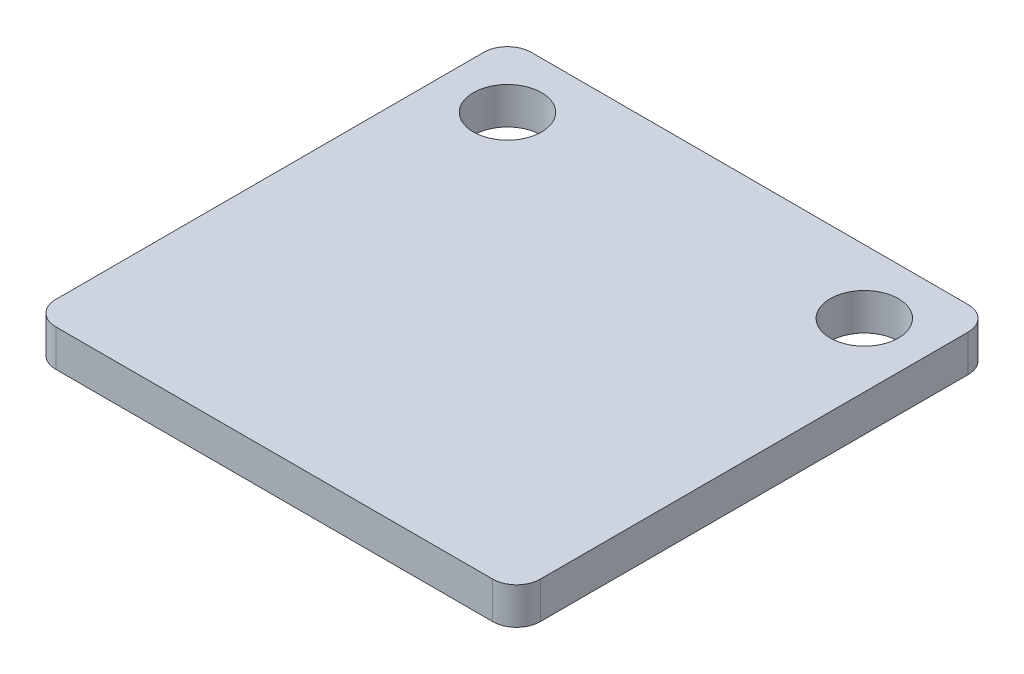
ISO-10303-21;
HEADER;
FILE_DESCRIPTION(('STEP AP214'),'2;1');
FILE_NAME('part.step','',(''),(''),'','','');
FILE_SCHEMA(('AUTOMOTIVE_DESIGN { 1 0 10303 214 1 1 1 1 }'));
ENDSEC;
DATA;
#1=APPLICATION_CONTEXT('core data for automotive mechanical design processes');
#2=APPLICATION_PROTOCOL_DEFINITION('international standard','automotive_design',2000,#1);
#3=PRODUCT_CONTEXT('',#1,'mechanical');
#4=PRODUCT('Part','Part','',(#3));
#5=PRODUCT_RELATED_PRODUCT_CATEGORY('part','',(#4));
#6=PRODUCT_DEFINITION_FORMATION('','',#4);
#7=PRODUCT_DEFINITION_CONTEXT('part definition',#1,'design');
#8=PRODUCT_DEFINITION('design','',#6,#7);
#9=PRODUCT_DEFINITION_SHAPE('','',#8);
#10=(LENGTH_UNIT() NAMED_UNIT(*) SI_UNIT(.MILLI.,.METRE.));
#11=(NAMED_UNIT(*) PLANE_ANGLE_UNIT() SI_UNIT($,.RADIAN.));
#12=(NAMED_UNIT(*) SI_UNIT($,.STERADIAN.) SOLID_ANGLE_UNIT());
#13=UNCERTAINTY_MEASURE_WITH_UNIT(LENGTH_MEASURE(1.E-05),#10,'distance_accuracy_value','');
#14=(GEOMETRIC_REPRESENTATION_CONTEXT(3) GLOBAL_UNCERTAINTY_ASSIGNED_CONTEXT((#13)) GLOBAL_UNIT_ASSIGNED_CONTEXT((#10,
#11,#12)) REPRESENTATION_CONTEXT('',''));
#15=CARTESIAN_POINT('',(0.,0.,0.));
#16=DIRECTION('',(0.,0.,1.));
#17=DIRECTION('',(1.,0.,0.));
#18=AXIS2_PLACEMENT_3D('',#15,#16,#17);
#19=CARTESIAN_POINT('',(0.,-0.775,0.));
#20=DIRECTION('',(0.,-1.,0.));
#21=DIRECTION('',(0.,0.,-1.));
#22=AXIS2_PLACEMENT_3D('',#19,#20,#21);
#23=PLANE('',#22);
#24=CARTESIAN_POINT('',(-7.50499999999992,-0.775,-7.31500000000006));
#25=DIRECTION('',(0.,1.,0.));
#26=DIRECTION('',(0.,0.,1.));
#27=AXIS2_PLACEMENT_3D('',#24,#25,#26);
#28=CIRCLE('',#27,1.435);
#29=CARTESIAN_POINT('',(-7.50499999999992,-0.775,-5.88000000000005));
#30=VERTEX_POINT('',#29);
#31=EDGE_CURVE('E155',#30,#30,#28,.T.);
#32=ORIENTED_EDGE('',*,*,#31,.T.);
#33=EDGE_LOOP('',(#32));
#34=FACE_BOUND('',#33,.T.);
#35=CARTESIAN_POINT('',(7.50500000000009,-0.775,-7.31500000000006));
#36=DIRECTION('',(0.,1.,0.));
#37=DIRECTION('',(0.,0.,1.));
#38=AXIS2_PLACEMENT_3D('',#35,#36,#37);
#39=CIRCLE('',#38,1.435);
#40=CARTESIAN_POINT('',(7.50500000000009,-0.775,-5.88000000000005));
#41=VERTEX_POINT('',#40);
#42=EDGE_CURVE('E152',#41,#41,#39,.T.);
#43=ORIENTED_EDGE('',*,*,#42,.T.);
#44=EDGE_LOOP('',(#43));
#45=FACE_BOUND('',#44,.T.);
#46=DIRECTION('',(0.,0.,-1.));
#47=VECTOR('',#46,1.);
#48=CARTESIAN_POINT('',(10.1900000000001,-0.775,9.99999999999994));
#49=LINE('',#48,#47);
#50=CARTESIAN_POINT('',(10.1900000000001,-0.775,8.99999999999994));
#51=VERTEX_POINT('',#50);
#52=CARTESIAN_POINT('',(10.1900000000001,-0.775,-9.00000000000006));
#53=VERTEX_POINT('',#52);
#54=EDGE_CURVE('E168',#51,#53,#49,.T.);
#55=ORIENTED_EDGE('',*,*,#54,.F.);
#56=CARTESIAN_POINT('',(9.19000000000009,-0.775,8.99999999999994));
#57=DIRECTION('',(0.,-1.,0.));
#58=DIRECTION('',(0.,0.,-1.));
#59=AXIS2_PLACEMENT_3D('',#56,#57,#58);
#60=CIRCLE('',#59,1.);
#61=CARTESIAN_POINT('',(9.19000000000009,-0.775,9.99999999999994));
#62=VERTEX_POINT('',#61);
#63=EDGE_CURVE('E201',#51,#62,#60,.T.);
#64=ORIENTED_EDGE('',*,*,#63,.T.);
#65=DIRECTION('',(1.,0.,0.));
#66=VECTOR('',#65,1.);
#67=CARTESIAN_POINT('',(-10.1899999999999,-0.775,9.99999999999994));
#68=LINE('',#67,#66);
#69=CARTESIAN_POINT('',(-9.18999999999992,-0.775,9.99999999999994));
#70=VERTEX_POINT('',#69);
#71=EDGE_CURVE('E173',#70,#62,#68,.T.);
#72=ORIENTED_EDGE('',*,*,#71,.F.);
#73=CARTESIAN_POINT('',(-9.18999999999992,-0.775,8.99999999999994));
#74=DIRECTION('',(0.,-1.,0.));
#75=DIRECTION('',(0.,0.,-1.));
#76=AXIS2_PLACEMENT_3D('',#73,#74,#75);
#77=CIRCLE('',#76,1.);
#78=CARTESIAN_POINT('',(-10.1899999999999,-0.775,8.99999999999994));
#79=VERTEX_POINT('',#78);
#80=EDGE_CURVE('E199',#70,#79,#77,.T.);
#81=ORIENTED_EDGE('',*,*,#80,.T.);
#82=DIRECTION('',(0.,0.,1.));
#83=VECTOR('',#82,1.);
#84=CARTESIAN_POINT('',(-10.1899999999999,-0.775,9.99999999999994));
#85=LINE('',#84,#83);
#86=CARTESIAN_POINT('',(-10.1899999999999,-0.775,-9.00000000000006));
#87=VERTEX_POINT('',#86);
#88=EDGE_CURVE('E187',#87,#79,#85,.T.);
#89=ORIENTED_EDGE('',*,*,#88,.F.);
#90=CARTESIAN_POINT('',(-9.18999999999992,-0.775,-9.00000000000006));
#91=DIRECTION('',(0.,-1.,0.));
#92=DIRECTION('',(0.,0.,-1.));
#93=AXIS2_PLACEMENT_3D('',#90,#91,#92);
#94=CIRCLE('',#93,1.);
#95=CARTESIAN_POINT('',(-9.18999999999992,-0.775,-10.0000000000001));
#96=VERTEX_POINT('',#95);
#97=EDGE_CURVE('E195',#87,#96,#94,.T.);
#98=ORIENTED_EDGE('',*,*,#97,.T.);
#99=DIRECTION('',(-1.,0.,0.));
#100=VECTOR('',#99,1.);
#101=CARTESIAN_POINT('',(-10.1899999999999,-0.775,-10.0000000000001));
#102=LINE('',#101,#100);
#103=CARTESIAN_POINT('',(9.19000000000008,-0.775,-10.0000000000001));
#104=VERTEX_POINT('',#103);
#105=EDGE_CURVE('E184',#104,#96,#102,.T.);
#106=ORIENTED_EDGE('',*,*,#105,.F.);
#107=CARTESIAN_POINT('',(9.19000000000008,-0.775,-9.00000000000006));
#108=DIRECTION('',(0.,-1.,0.));
#109=DIRECTION('',(0.,0.,-1.));
#110=AXIS2_PLACEMENT_3D('',#107,#108,#109);
#111=CIRCLE('',#110,1.);
#112=EDGE_CURVE('E197',#104,#53,#111,.T.);
#113=ORIENTED_EDGE('',*,*,#112,.T.);
#114=EDGE_LOOP('',(#55,#64,#72,#81,#89,#98,#106,#113));
#115=FACE_BOUND('',#114,.T.);
#116=DIRECTION('',(1.,0.,0.));
#117=VECTOR('',#116,1.);
#118=CARTESIAN_POINT('',(1.,-0.775,-1.28));
#119=LINE('',#118,#117);
#120=CARTESIAN_POINT('',(-1.,-0.775,-1.28));
#121=VERTEX_POINT('',#120);
#122=CARTESIAN_POINT('',(1.,-0.775,-1.28));
#123=VERTEX_POINT('',#122);
#124=EDGE_CURVE('E411',#121,#123,#119,.T.);
#125=ORIENTED_EDGE('',*,*,#124,.F.);
#126=DIRECTION('',(0.,0.,-1.));
#127=VECTOR('',#126,1.);
#128=CARTESIAN_POINT('',(-1.,-0.775,1.28));
#129=LINE('',#128,#127);
#130=CARTESIAN_POINT('',(-1.,-0.775,1.28));
#131=VERTEX_POINT('',#130);
#132=EDGE_CURVE('E150',#131,#121,#129,.T.);
#133=ORIENTED_EDGE('',*,*,#132,.F.);
#134=DIRECTION('',(-1.,0.,0.));
#135=VECTOR('',#134,1.);
#136=CARTESIAN_POINT('',(1.,-0.775,1.28));
#137=LINE('',#136,#135);
#138=CARTESIAN_POINT('',(1.,-0.775,1.28));
#139=VERTEX_POINT('',#138);
#140=EDGE_CURVE('E146',#139,#131,#137,.T.);
#141=ORIENTED_EDGE('',*,*,#140,.F.);
#142=DIRECTION('',(0.,0.,1.));
#143=VECTOR('',#142,1.);
#144=CARTESIAN_POINT('',(1.,-0.775,1.28));
#145=LINE('',#144,#143);
#146=EDGE_CURVE('E408',#123,#139,#145,.T.);
#147=ORIENTED_EDGE('',*,*,#146,.F.);
#148=EDGE_LOOP('',(#125,#133,#141,#147));
#149=FACE_BOUND('',#148,.T.);
#150=ADVANCED_FACE('F36',(#34,#45,#115,#149),#23,.T.);
#151=CARTESIAN_POINT('',(10.1900000000001,0.775,9.99999999999994));
#152=DIRECTION('',(-1.,0.,0.));
#153=DIRECTION('',(0.,0.,1.));
#154=AXIS2_PLACEMENT_3D('',#151,#152,#153);
#155=PLANE('',#154);
#156=DIRECTION('',(0.,0.,-1.));
#157=VECTOR('',#156,1.);
#158=CARTESIAN_POINT('',(10.1900000000001,0.775,9.99999999999994));
#159=LINE('',#158,#157);
#160=CARTESIAN_POINT('',(10.1900000000001,0.775,8.99999999999994));
#161=VERTEX_POINT('',#160);
#162=CARTESIAN_POINT('',(10.1900000000001,0.775,-9.00000000000006));
#163=VERTEX_POINT('',#162);
#164=EDGE_CURVE('E169',#161,#163,#159,.T.);
#165=ORIENTED_EDGE('',*,*,#164,.F.);
#166=DIRECTION('',(0.,-1.,0.));
#167=VECTOR('',#166,1.);
#168=CARTESIAN_POINT('',(10.1900000000001,0.775,8.99999999999994));
#169=LINE('',#168,#167);
#170=EDGE_CURVE('E192',#161,#51,#169,.T.);
#171=ORIENTED_EDGE('',*,*,#170,.T.);
#172=ORIENTED_EDGE('',*,*,#54,.T.);
#173=DIRECTION('',(0.,-1.,0.));
#174=VECTOR('',#173,1.);
#175=CARTESIAN_POINT('',(10.1900000000001,0.775,-9.00000000000006));
#176=LINE('',#175,#174);
#177=EDGE_CURVE('E181',#53,#163,#176,.F.);
#178=ORIENTED_EDGE('',*,*,#177,.T.);
#179=EDGE_LOOP('',(#165,#171,#172,#178));
#180=FACE_BOUND('',#179,.T.);
#181=ADVANCED_FACE('F251',(#180),#155,.F.);
#182=CARTESIAN_POINT('',(-10.1899999999999,0.775,-10.0000000000001));
#183=DIRECTION('',(0.,0.,1.));
#184=DIRECTION('',(1.,0.,0.));
#185=AXIS2_PLACEMENT_3D('',#182,#183,#184);
#186=PLANE('',#185);
#187=DIRECTION('',(-1.,0.,0.));
#188=VECTOR('',#187,1.);
#189=CARTESIAN_POINT('',(-10.1899999999999,0.775,-10.0000000000001));
#190=LINE('',#189,#188);
#191=CARTESIAN_POINT('',(9.19000000000008,0.775,-10.0000000000001));
#192=VERTEX_POINT('',#191);
#193=CARTESIAN_POINT('',(-9.18999999999992,0.775,-10.0000000000001));
#194=VERTEX_POINT('',#193);
#195=EDGE_CURVE('E172',#192,#194,#190,.T.);
#196=ORIENTED_EDGE('',*,*,#195,.F.);
#197=DIRECTION('',(0.,-1.,0.));
#198=VECTOR('',#197,1.);
#199=CARTESIAN_POINT('',(9.19000000000008,0.775,-10.0000000000001));
#200=LINE('',#199,#198);
#201=EDGE_CURVE('E11',#192,#104,#200,.T.);
#202=ORIENTED_EDGE('',*,*,#201,.T.);
#203=ORIENTED_EDGE('',*,*,#105,.T.);
#204=DIRECTION('',(0.,-1.,0.));
#205=VECTOR('',#204,1.);
#206=CARTESIAN_POINT('',(-9.18999999999992,0.775,-10.0000000000001));
#207=LINE('',#206,#205);
#208=EDGE_CURVE('E44',#96,#194,#207,.F.);
#209=ORIENTED_EDGE('',*,*,#208,.T.);
#210=EDGE_LOOP('',(#196,#202,#203,#209));
#211=FACE_BOUND('',#210,.T.);
#212=ADVANCED_FACE('F222',(#211),#186,.F.);
#213=CARTESIAN_POINT('',(-10.1899999999999,0.775,9.99999999999994));
#214=DIRECTION('',(1.,0.,0.));
#215=DIRECTION('',(0.,0.,-1.));
#216=AXIS2_PLACEMENT_3D('',#213,#214,#215);
#217=PLANE('',#216);
#218=ORIENTED_EDGE('',*,*,#88,.T.);
#219=DIRECTION('',(0.,-1.,0.));
#220=VECTOR('',#219,1.);
#221=CARTESIAN_POINT('',(-10.1899999999999,0.775,8.99999999999994));
#222=LINE('',#221,#220);
#223=CARTESIAN_POINT('',(-10.1899999999999,0.775,8.99999999999994));
#224=VERTEX_POINT('',#223);
#225=EDGE_CURVE('E59',#79,#224,#222,.F.);
#226=ORIENTED_EDGE('',*,*,#225,.T.);
#227=DIRECTION('',(0.,0.,1.));
#228=VECTOR('',#227,1.);
#229=CARTESIAN_POINT('',(-10.1899999999999,0.775,9.99999999999994));
#230=LINE('',#229,#228);
#231=CARTESIAN_POINT('',(-10.1899999999999,0.775,-9.00000000000006));
#232=VERTEX_POINT('',#231);
#233=EDGE_CURVE('E176',#232,#224,#230,.T.);
#234=ORIENTED_EDGE('',*,*,#233,.F.);
#235=DIRECTION('',(0.,-1.,0.));
#236=VECTOR('',#235,1.);
#237=CARTESIAN_POINT('',(-10.1899999999999,0.775,-9.00000000000006));
#238=LINE('',#237,#236);
#239=EDGE_CURVE('E216',#232,#87,#238,.T.);
#240=ORIENTED_EDGE('',*,*,#239,.T.);
#241=EDGE_LOOP('',(#218,#226,#234,#240));
#242=FACE_BOUND('',#241,.T.);
#243=ADVANCED_FACE('F232',(#242),#217,.F.);
#244=CARTESIAN_POINT('',(-10.1899999999999,0.775,9.99999999999994));
#245=DIRECTION('',(0.,0.,-1.));
#246=DIRECTION('',(-1.,0.,0.));
#247=AXIS2_PLACEMENT_3D('',#244,#245,#246);
#248=PLANE('',#247);
#249=ORIENTED_EDGE('',*,*,#71,.T.);
#250=DIRECTION('',(0.,-1.,0.));
#251=VECTOR('',#250,1.);
#252=CARTESIAN_POINT('',(9.19000000000009,0.775,9.99999999999994));
#253=LINE('',#252,#251);
#254=CARTESIAN_POINT('',(9.19000000000009,0.775,9.99999999999994));
#255=VERTEX_POINT('',#254);
#256=EDGE_CURVE('E206',#62,#255,#253,.F.);
#257=ORIENTED_EDGE('',*,*,#256,.T.);
#258=DIRECTION('',(1.,0.,0.));
#259=VECTOR('',#258,1.);
#260=CARTESIAN_POINT('',(-10.1899999999999,0.775,9.99999999999994));
#261=LINE('',#260,#259);
#262=CARTESIAN_POINT('',(-9.18999999999992,0.775,9.99999999999994));
#263=VERTEX_POINT('',#262);
#264=EDGE_CURVE('E178',#263,#255,#261,.T.);
#265=ORIENTED_EDGE('',*,*,#264,.F.);
#266=DIRECTION('',(0.,-1.,0.));
#267=VECTOR('',#266,1.);
#268=CARTESIAN_POINT('',(-9.18999999999992,0.775,9.99999999999994));
#269=LINE('',#268,#267);
#270=EDGE_CURVE('E203',#263,#70,#269,.T.);
#271=ORIENTED_EDGE('',*,*,#270,.T.);
#272=EDGE_LOOP('',(#249,#257,#265,#271));
#273=FACE_BOUND('',#272,.T.);
#274=ADVANCED_FACE('F243',(#273),#248,.F.);
#275=CARTESIAN_POINT('',(0.,0.775,0.));
#276=DIRECTION('',(0.,-1.,0.));
#277=DIRECTION('',(0.,0.,-1.));
#278=AXIS2_PLACEMENT_3D('',#275,#276,#277);
#279=PLANE('',#278);
#280=CARTESIAN_POINT('',(-7.50499999999992,0.775,-7.31500000000006));
#281=DIRECTION('',(0.,-1.,0.));
#282=DIRECTION('',(0.,0.,-1.));
#283=AXIS2_PLACEMENT_3D('',#280,#281,#282);
#284=CIRCLE('',#283,1.435);
#285=CARTESIAN_POINT('',(-7.50499999999992,0.775,-5.88000000000005));
#286=VERTEX_POINT('',#285);
#287=EDGE_CURVE('E165',#286,#286,#284,.T.);
#288=ORIENTED_EDGE('',*,*,#287,.T.);
#289=EDGE_LOOP('',(#288));
#290=FACE_BOUND('',#289,.T.);
#291=CARTESIAN_POINT('',(7.50500000000009,0.775,-7.31500000000006));
#292=DIRECTION('',(0.,-1.,0.));
#293=DIRECTION('',(0.,0.,-1.));
#294=AXIS2_PLACEMENT_3D('',#291,#292,#293);
#295=CIRCLE('',#294,1.435);
#296=CARTESIAN_POINT('',(7.50500000000009,0.775,-5.88000000000005));
#297=VERTEX_POINT('',#296);
#298=EDGE_CURVE('E161',#297,#297,#295,.T.);
#299=ORIENTED_EDGE('',*,*,#298,.T.);
#300=EDGE_LOOP('',(#299));
#301=FACE_BOUND('',#300,.T.);
#302=ORIENTED_EDGE('',*,*,#264,.T.);
#303=CARTESIAN_POINT('',(9.19000000000009,0.775,8.99999999999994));
#304=DIRECTION('',(0.,-1.,0.));
#305=DIRECTION('',(0.,0.,-1.));
#306=AXIS2_PLACEMENT_3D('',#303,#304,#305);
#307=CIRCLE('',#306,1.);
#308=EDGE_CURVE('E214',#255,#161,#307,.F.);
#309=ORIENTED_EDGE('',*,*,#308,.T.);
#310=ORIENTED_EDGE('',*,*,#164,.T.);
#311=CARTESIAN_POINT('',(9.19000000000008,0.775,-9.00000000000006));
#312=DIRECTION('',(0.,-1.,0.));
#313=DIRECTION('',(0.,0.,-1.));
#314=AXIS2_PLACEMENT_3D('',#311,#312,#313);
#315=CIRCLE('',#314,1.);
#316=EDGE_CURVE('E210',#163,#192,#315,.F.);
#317=ORIENTED_EDGE('',*,*,#316,.T.);
#318=ORIENTED_EDGE('',*,*,#195,.T.);
#319=CARTESIAN_POINT('',(-9.18999999999992,0.775,-9.00000000000006));
#320=DIRECTION('',(0.,-1.,0.));
#321=DIRECTION('',(0.,0.,-1.));
#322=AXIS2_PLACEMENT_3D('',#319,#320,#321);
#323=CIRCLE('',#322,1.);
#324=EDGE_CURVE('E208',#194,#232,#323,.F.);
#325=ORIENTED_EDGE('',*,*,#324,.T.);
#326=ORIENTED_EDGE('',*,*,#233,.T.);
#327=CARTESIAN_POINT('',(-9.18999999999992,0.775,8.99999999999994));
#328=DIRECTION('',(0.,-1.,0.));
#329=DIRECTION('',(0.,0.,-1.));
#330=AXIS2_PLACEMENT_3D('',#327,#328,#329);
#331=CIRCLE('',#330,1.);
#332=EDGE_CURVE('E212',#224,#263,#331,.F.);
#333=ORIENTED_EDGE('',*,*,#332,.T.);
#334=EDGE_LOOP('',(#302,#309,#310,#317,#318,#325,#326,#333));
#335=FACE_BOUND('',#334,.T.);
#336=ADVANCED_FACE('F228',(#290,#301,#335),#279,.F.);
#337=CARTESIAN_POINT('',(7.50500000000009,-0.775,-7.31500000000006));
#338=DIRECTION('',(0.,1.,0.));
#339=DIRECTION('',(0.,0.,1.));
#340=AXIS2_PLACEMENT_3D('',#337,#338,#339);
#341=CYLINDRICAL_SURFACE('',#340,1.435);
#342=CARTESIAN_POINT('',(7.50500000000009,-0.775,-5.88000000000005));
#343=CARTESIAN_POINT('',(7.50500000000009,-0.758854166666667,-5.88000000000005));
#344=CARTESIAN_POINT('',(7.50500000000009,-0.742708333333333,-5.88000000000005));
#345=CARTESIAN_POINT('',(7.50500000000009,-0.710416666666667,-5.88000000000005));
#346=CARTESIAN_POINT('',(7.50500000000009,-0.694270833333333,-5.88000000000005));
#347=CARTESIAN_POINT('',(7.50500000000009,-0.661979166666667,-5.88000000000005));
#348=CARTESIAN_POINT('',(7.50500000000009,-0.645833333333333,-5.88000000000005));
#349=CARTESIAN_POINT('',(7.50500000000009,-0.613541666666667,-5.88000000000005));
#350=CARTESIAN_POINT('',(7.50500000000009,-0.597395833333333,-5.88000000000005));
#351=CARTESIAN_POINT('',(7.50500000000009,-0.565104166666667,-5.88000000000005));
#352=CARTESIAN_POINT('',(7.50500000000009,-0.548958333333333,-5.88000000000005));
#353=CARTESIAN_POINT('',(7.50500000000009,-0.516666666666667,-5.88000000000005));
#354=CARTESIAN_POINT('',(7.50500000000009,-0.500520833333333,-5.88000000000005));
#355=CARTESIAN_POINT('',(7.50500000000009,-0.468229166666667,-5.88000000000005));
#356=CARTESIAN_POINT('',(7.50500000000009,-0.452083333333333,-5.88000000000005));
#357=CARTESIAN_POINT('',(7.50500000000009,-0.419791666666667,-5.88000000000005));
#358=CARTESIAN_POINT('',(7.50500000000009,-0.403645833333333,-5.88000000000005));
#359=CARTESIAN_POINT('',(7.50500000000009,-0.371354166666667,-5.88000000000005));
#360=CARTESIAN_POINT('',(7.50500000000009,-0.355208333333333,-5.88000000000005));
#361=CARTESIAN_POINT('',(7.50500000000009,-0.322916666666667,-5.88000000000005));
#362=CARTESIAN_POINT('',(7.50500000000009,-0.306770833333333,-5.88000000000005));
#363=CARTESIAN_POINT('',(7.50500000000009,-0.274479166666667,-5.88000000000005));
#364=CARTESIAN_POINT('',(7.50500000000009,-0.258333333333333,-5.88000000000005));
#365=CARTESIAN_POINT('',(7.50500000000009,-0.226041666666667,-5.88000000000005));
#366=CARTESIAN_POINT('',(7.50500000000009,-0.209895833333333,-5.88000000000005));
#367=CARTESIAN_POINT('',(7.50500000000009,-0.177604166666667,-5.88000000000005));
#368=CARTESIAN_POINT('',(7.50500000000009,-0.161458333333333,-5.88000000000005));
#369=CARTESIAN_POINT('',(7.50500000000009,-0.129166666666667,-5.88000000000005));
#370=CARTESIAN_POINT('',(7.50500000000009,-0.113020833333333,-5.88000000000005));
#371=CARTESIAN_POINT('',(7.50500000000009,-0.0807291666666667,-5.88000000000005));
#372=CARTESIAN_POINT('',(7.50500000000009,-0.0645833333333334,-5.88000000000005));
#373=CARTESIAN_POINT('',(7.50500000000009,-0.0322916666666668,-5.88000000000005));
#374=CARTESIAN_POINT('',(7.50500000000009,-0.0161458333333334,-5.88000000000005));
#375=CARTESIAN_POINT('',(7.50500000000009,0.0161458333333332,-5.88000000000005));
#376=CARTESIAN_POINT('',(7.50500000000009,0.0322916666666665,-5.88000000000005));
#377=CARTESIAN_POINT('',(7.50500000000009,0.0645833333333332,-5.88000000000005));
#378=CARTESIAN_POINT('',(7.50500000000009,0.0807291666666665,-5.88000000000005));
#379=CARTESIAN_POINT('',(7.50500000000009,0.113020833333333,-5.88000000000005));
#380=CARTESIAN_POINT('',(7.50500000000009,0.129166666666667,-5.88000000000005));
#381=CARTESIAN_POINT('',(7.50500000000009,0.161458333333333,-5.88000000000005));
#382=CARTESIAN_POINT('',(7.50500000000009,0.177604166666667,-5.88000000000005));
#383=CARTESIAN_POINT('',(7.50500000000009,0.209895833333333,-5.88000000000005));
#384=CARTESIAN_POINT('',(7.50500000000009,0.226041666666667,-5.88000000000005));
#385=CARTESIAN_POINT('',(7.50500000000009,0.258333333333333,-5.88000000000005));
#386=CARTESIAN_POINT('',(7.50500000000009,0.274479166666667,-5.88000000000005));
#387=CARTESIAN_POINT('',(7.50500000000009,0.306770833333333,-5.88000000000005));
#388=CARTESIAN_POINT('',(7.50500000000009,0.322916666666667,-5.88000000000005));
#389=CARTESIAN_POINT('',(7.50500000000009,0.355208333333333,-5.88000000000005));
#390=CARTESIAN_POINT('',(7.50500000000009,0.371354166666667,-5.88000000000005));
#391=CARTESIAN_POINT('',(7.50500000000009,0.403645833333333,-5.88000000000005));
#392=CARTESIAN_POINT('',(7.50500000000009,0.419791666666667,-5.88000000000005));
#393=CARTESIAN_POINT('',(7.50500000000009,0.452083333333333,-5.88000000000005));
#394=CARTESIAN_POINT('',(7.50500000000009,0.468229166666667,-5.88000000000005));
#395=CARTESIAN_POINT('',(7.50500000000009,0.500520833333333,-5.88000000000005));
#396=CARTESIAN_POINT('',(7.50500000000009,0.516666666666667,-5.88000000000005));
#397=CARTESIAN_POINT('',(7.50500000000009,0.548958333333333,-5.88000000000005));
#398=CARTESIAN_POINT('',(7.50500000000009,0.565104166666667,-5.88000000000005));
#399=CARTESIAN_POINT('',(7.50500000000009,0.597395833333333,-5.88000000000005));
#400=CARTESIAN_POINT('',(7.50500000000009,0.613541666666667,-5.88000000000005));
#401=CARTESIAN_POINT('',(7.50500000000009,0.645833333333333,-5.88000000000005));
#402=CARTESIAN_POINT('',(7.50500000000009,0.661979166666667,-5.88000000000005));
#403=CARTESIAN_POINT('',(7.50500000000009,0.694270833333333,-5.88000000000005));
#404=CARTESIAN_POINT('',(7.50500000000009,0.710416666666667,-5.88000000000005));
#405=CARTESIAN_POINT('',(7.50500000000009,0.742708333333333,-5.88000000000005));
#406=CARTESIAN_POINT('',(7.50500000000009,0.758854166666667,-5.88000000000005));
#407=CARTESIAN_POINT('',(7.50500000000009,0.775,-5.88000000000005));
#408=B_SPLINE_CURVE_WITH_KNOTS('',3,(#342,#343,#344,#345,#346,#347,#348,#349,#350,#351,#352,
#353,#354,#355,#356,#357,#358,#359,#360,#361,#362,#363,#364,#365,#366,#367,#368,#369,#370,#371,
#372,#373,#374,#375,#376,#377,#378,#379,#380,#381,#382,#383,#384,#385,#386,#387,#388,#389,#390,
#391,#392,#393,#394,#395,#396,#397,#398,#399,#400,#401,#402,#403,#404,#405,#406,#407),
.UNSPECIFIED.,.F.,.F.,(4,2,2,2,2,2,2,2,2,2,2,2,2,2,2,2,2,2,2,2,2,2,2,2,2,2,2,2,2,2,2,2,4),(0.,
0.0484375000000001,0.0968750000000001,0.1453125,0.19375,0.2421875,0.290625,0.3390625,0.3875,
0.4359375,0.484375,0.5328125,0.58125,0.6296875,0.678125,0.7265625,0.775,0.8234375,0.871875,
0.9203125,0.96875,1.0171875,1.065625,1.1140625,1.1625,1.2109375,1.259375,1.3078125,1.35625,
1.4046875,1.453125,1.5015625,1.55),.UNSPECIFIED.);
#409=EDGE_CURVE('BSEAM283',#41,#297,#408,.T.);
#410=ORIENTED_EDGE('',*,*,#42,.F.);
#411=ORIENTED_EDGE('',*,*,#298,.F.);
#412=ORIENTED_EDGE('',*,*,#409,.T.);
#413=ORIENTED_EDGE('',*,*,#409,.F.);
#414=EDGE_LOOP('',(#410,#412,#411,#413));
#415=FACE_BOUND('',#414,.T.);
#416=ADVANCED_FACE('F283',(#415),#341,.F.);
#417=CARTESIAN_POINT('',(-7.50499999999992,-0.775,-7.31500000000006));
#418=DIRECTION('',(0.,1.,0.));
#419=DIRECTION('',(0.,0.,1.));
#420=AXIS2_PLACEMENT_3D('',#417,#418,#419);
#421=CYLINDRICAL_SURFACE('',#420,1.435);
#422=CARTESIAN_POINT('',(-7.50499999999992,-0.775,-5.88000000000005));
#423=CARTESIAN_POINT('',(-7.50499999999992,-0.758854166666667,-5.88000000000005));
#424=CARTESIAN_POINT('',(-7.50499999999992,-0.742708333333333,-5.88000000000005));
#425=CARTESIAN_POINT('',(-7.50499999999992,-0.710416666666667,-5.88000000000005));
#426=CARTESIAN_POINT('',(-7.50499999999992,-0.694270833333333,-5.88000000000005));
#427=CARTESIAN_POINT('',(-7.50499999999992,-0.661979166666667,-5.88000000000005));
#428=CARTESIAN_POINT('',(-7.50499999999992,-0.645833333333333,-5.88000000000005));
#429=CARTESIAN_POINT('',(-7.50499999999992,-0.613541666666667,-5.88000000000005));
#430=CARTESIAN_POINT('',(-7.50499999999992,-0.597395833333333,-5.88000000000005));
#431=CARTESIAN_POINT('',(-7.50499999999992,-0.565104166666667,-5.88000000000005));
#432=CARTESIAN_POINT('',(-7.50499999999992,-0.548958333333333,-5.88000000000005));
#433=CARTESIAN_POINT('',(-7.50499999999992,-0.516666666666667,-5.88000000000005));
#434=CARTESIAN_POINT('',(-7.50499999999992,-0.500520833333333,-5.88000000000005));
#435=CARTESIAN_POINT('',(-7.50499999999992,-0.468229166666667,-5.88000000000005));
#436=CARTESIAN_POINT('',(-7.50499999999992,-0.452083333333333,-5.88000000000005));
#437=CARTESIAN_POINT('',(-7.50499999999992,-0.419791666666667,-5.88000000000005));
#438=CARTESIAN_POINT('',(-7.50499999999992,-0.403645833333333,-5.88000000000005));
#439=CARTESIAN_POINT('',(-7.50499999999992,-0.371354166666667,-5.88000000000005));
#440=CARTESIAN_POINT('',(-7.50499999999992,-0.355208333333333,-5.88000000000005));
#441=CARTESIAN_POINT('',(-7.50499999999992,-0.322916666666667,-5.88000000000005));
#442=CARTESIAN_POINT('',(-7.50499999999992,-0.306770833333333,-5.88000000000005));
#443=CARTESIAN_POINT('',(-7.50499999999992,-0.274479166666667,-5.88000000000005));
#444=CARTESIAN_POINT('',(-7.50499999999992,-0.258333333333333,-5.88000000000005));
#445=CARTESIAN_POINT('',(-7.50499999999992,-0.226041666666667,-5.88000000000005));
#446=CARTESIAN_POINT('',(-7.50499999999992,-0.209895833333333,-5.88000000000005));
#447=CARTESIAN_POINT('',(-7.50499999999992,-0.177604166666667,-5.88000000000005));
#448=CARTESIAN_POINT('',(-7.50499999999992,-0.161458333333333,-5.88000000000005));
#449=CARTESIAN_POINT('',(-7.50499999999992,-0.129166666666667,-5.88000000000005));
#450=CARTESIAN_POINT('',(-7.50499999999992,-0.113020833333333,-5.88000000000005));
#451=CARTESIAN_POINT('',(-7.50499999999992,-0.0807291666666667,-5.88000000000005));
#452=CARTESIAN_POINT('',(-7.50499999999992,-0.0645833333333334,-5.88000000000005));
#453=CARTESIAN_POINT('',(-7.50499999999992,-0.0322916666666668,-5.88000000000005));
#454=CARTESIAN_POINT('',(-7.50499999999992,-0.0161458333333334,-5.88000000000005));
#455=CARTESIAN_POINT('',(-7.50499999999992,0.0161458333333332,-5.88000000000005));
#456=CARTESIAN_POINT('',(-7.50499999999992,0.0322916666666665,-5.88000000000005));
#457=CARTESIAN_POINT('',(-7.50499999999992,0.0645833333333332,-5.88000000000005));
#458=CARTESIAN_POINT('',(-7.50499999999992,0.0807291666666665,-5.88000000000005));
#459=CARTESIAN_POINT('',(-7.50499999999992,0.113020833333333,-5.88000000000005));
#460=CARTESIAN_POINT('',(-7.50499999999992,0.129166666666667,-5.88000000000005));
#461=CARTESIAN_POINT('',(-7.50499999999992,0.161458333333333,-5.88000000000005));
#462=CARTESIAN_POINT('',(-7.50499999999992,0.177604166666667,-5.88000000000005));
#463=CARTESIAN_POINT('',(-7.50499999999992,0.209895833333333,-5.88000000000005));
#464=CARTESIAN_POINT('',(-7.50499999999992,0.226041666666667,-5.88000000000005));
#465=CARTESIAN_POINT('',(-7.50499999999992,0.258333333333333,-5.88000000000005));
#466=CARTESIAN_POINT('',(-7.50499999999992,0.274479166666667,-5.88000000000005));
#467=CARTESIAN_POINT('',(-7.50499999999992,0.306770833333333,-5.88000000000005));
#468=CARTESIAN_POINT('',(-7.50499999999992,0.322916666666667,-5.88000000000005));
#469=CARTESIAN_POINT('',(-7.50499999999992,0.355208333333333,-5.88000000000005));
#470=CARTESIAN_POINT('',(-7.50499999999992,0.371354166666667,-5.88000000000005));
#471=CARTESIAN_POINT('',(-7.50499999999992,0.403645833333333,-5.88000000000005));
#472=CARTESIAN_POINT('',(-7.50499999999992,0.419791666666667,-5.88000000000005));
#473=CARTESIAN_POINT('',(-7.50499999999992,0.452083333333333,-5.88000000000005));
#474=CARTESIAN_POINT('',(-7.50499999999992,0.468229166666667,-5.88000000000005));
#475=CARTESIAN_POINT('',(-7.50499999999992,0.500520833333333,-5.88000000000005));
#476=CARTESIAN_POINT('',(-7.50499999999992,0.516666666666667,-5.88000000000005));
#477=CARTESIAN_POINT('',(-7.50499999999992,0.548958333333333,-5.88000000000005));
#478=CARTESIAN_POINT('',(-7.50499999999992,0.565104166666667,-5.88000000000005));
#479=CARTESIAN_POINT('',(-7.50499999999992,0.597395833333333,-5.88000000000005));
#480=CARTESIAN_POINT('',(-7.50499999999992,0.613541666666667,-5.88000000000005));
#481=CARTESIAN_POINT('',(-7.50499999999992,0.645833333333333,-5.88000000000005));
#482=CARTESIAN_POINT('',(-7.50499999999992,0.661979166666667,-5.88000000000005));
#483=CARTESIAN_POINT('',(-7.50499999999992,0.694270833333333,-5.88000000000005));
#484=CARTESIAN_POINT('',(-7.50499999999992,0.710416666666667,-5.88000000000005));
#485=CARTESIAN_POINT('',(-7.50499999999992,0.742708333333333,-5.88000000000005));
#486=CARTESIAN_POINT('',(-7.50499999999992,0.758854166666667,-5.88000000000005));
#487=CARTESIAN_POINT('',(-7.50499999999992,0.775,-5.88000000000005));
#488=B_SPLINE_CURVE_WITH_KNOTS('',3,(#422,#423,#424,#425,#426,#427,#428,#429,#430,#431,#432,
#433,#434,#435,#436,#437,#438,#439,#440,#441,#442,#443,#444,#445,#446,#447,#448,#449,#450,#451,
#452,#453,#454,#455,#456,#457,#458,#459,#460,#461,#462,#463,#464,#465,#466,#467,#468,#469,#470,
#471,#472,#473,#474,#475,#476,#477,#478,#479,#480,#481,#482,#483,#484,#485,#486,#487),
.UNSPECIFIED.,.F.,.F.,(4,2,2,2,2,2,2,2,2,2,2,2,2,2,2,2,2,2,2,2,2,2,2,2,2,2,2,2,2,2,2,2,4),(0.,
0.0484375000000001,0.0968750000000001,0.1453125,0.19375,0.2421875,0.290625,0.3390625,0.3875,
0.4359375,0.484375,0.5328125,0.58125,0.6296875,0.678125,0.7265625,0.775,0.8234375,0.871875,
0.9203125,0.96875,1.0171875,1.065625,1.1140625,1.1625,1.2109375,1.259375,1.3078125,1.35625,
1.4046875,1.453125,1.5015625,1.55),.UNSPECIFIED.);
#489=EDGE_CURVE('BSEAM279',#30,#286,#488,.T.);
#490=ORIENTED_EDGE('',*,*,#31,.F.);
#491=ORIENTED_EDGE('',*,*,#287,.F.);
#492=ORIENTED_EDGE('',*,*,#489,.T.);
#493=ORIENTED_EDGE('',*,*,#489,.F.);
#494=EDGE_LOOP('',(#490,#492,#491,#493));
#495=FACE_BOUND('',#494,.T.);
#496=ADVANCED_FACE('F279',(#495),#421,.F.);
#497=CARTESIAN_POINT('',(9.19000000000009,0.775,8.99999999999994));
#498=DIRECTION('',(0.,-1.,0.));
#499=DIRECTION('',(0.,0.,-1.));
#500=AXIS2_PLACEMENT_3D('',#497,#498,#499);
#501=CYLINDRICAL_SURFACE('',#500,1.);
#502=ORIENTED_EDGE('',*,*,#308,.F.);
#503=ORIENTED_EDGE('',*,*,#256,.F.);
#504=ORIENTED_EDGE('',*,*,#63,.F.);
#505=ORIENTED_EDGE('',*,*,#170,.F.);
#506=EDGE_LOOP('',(#502,#503,#504,#505));
#507=FACE_BOUND('',#506,.T.);
#508=ADVANCED_FACE('F249',(#507),#501,.T.);
#509=CARTESIAN_POINT('',(-9.18999999999992,0.775,8.99999999999994));
#510=DIRECTION('',(0.,-1.,0.));
#511=DIRECTION('',(0.,0.,-1.));
#512=AXIS2_PLACEMENT_3D('',#509,#510,#511);
#513=CYLINDRICAL_SURFACE('',#512,1.);
#514=ORIENTED_EDGE('',*,*,#332,.F.);
#515=ORIENTED_EDGE('',*,*,#225,.F.);
#516=ORIENTED_EDGE('',*,*,#80,.F.);
#517=ORIENTED_EDGE('',*,*,#270,.F.);
#518=EDGE_LOOP('',(#514,#515,#516,#517));
#519=FACE_BOUND('',#518,.T.);
#520=ADVANCED_FACE('F240',(#519),#513,.T.);
#521=CARTESIAN_POINT('',(9.19000000000008,0.775,-9.00000000000006));
#522=DIRECTION('',(0.,-1.,0.));
#523=DIRECTION('',(0.,0.,-1.));
#524=AXIS2_PLACEMENT_3D('',#521,#522,#523);
#525=CYLINDRICAL_SURFACE('',#524,1.);
#526=ORIENTED_EDGE('',*,*,#316,.F.);
#527=ORIENTED_EDGE('',*,*,#177,.F.);
#528=ORIENTED_EDGE('',*,*,#112,.F.);
#529=ORIENTED_EDGE('',*,*,#201,.F.);
#530=EDGE_LOOP('',(#526,#527,#528,#529));
#531=FACE_BOUND('',#530,.T.);
#532=ADVANCED_FACE('F254',(#531),#525,.T.);
#533=CARTESIAN_POINT('',(-9.18999999999992,0.775,-9.00000000000006));
#534=DIRECTION('',(0.,-1.,0.));
#535=DIRECTION('',(0.,0.,-1.));
#536=AXIS2_PLACEMENT_3D('',#533,#534,#535);
#537=CYLINDRICAL_SURFACE('',#536,1.);
#538=ORIENTED_EDGE('',*,*,#324,.F.);
#539=ORIENTED_EDGE('',*,*,#208,.F.);
#540=ORIENTED_EDGE('',*,*,#97,.F.);
#541=ORIENTED_EDGE('',*,*,#239,.F.);
#542=EDGE_LOOP('',(#538,#539,#540,#541));
#543=FACE_BOUND('',#542,.T.);
#544=ADVANCED_FACE('F38',(#543),#537,.T.);
#545=CARTESIAN_POINT('',(-1.,-1.275,1.28));
#546=DIRECTION('',(1.,0.,0.));
#547=DIRECTION('',(0.,0.,-1.));
#548=AXIS2_PLACEMENT_3D('',#545,#546,#547);
#549=PLANE('',#548);
#550=ORIENTED_EDGE('',*,*,#132,.T.);
#551=DIRECTION('',(0.,1.,0.));
#552=VECTOR('',#551,1.);
#553=CARTESIAN_POINT('',(-1.,-1.275,-1.28));
#554=LINE('',#553,#552);
#555=CARTESIAN_POINT('',(-1.,-1.275,-1.28));
#556=VERTEX_POINT('',#555);
#557=EDGE_CURVE('E131',#556,#121,#554,.T.);
#558=ORIENTED_EDGE('',*,*,#557,.F.);
#559=DIRECTION('',(0.,0.,-1.));
#560=VECTOR('',#559,1.);
#561=CARTESIAN_POINT('',(-1.,-1.275,1.28));
#562=LINE('',#561,#560);
#563=CARTESIAN_POINT('',(-1.,-1.275,1.28));
#564=VERTEX_POINT('',#563);
#565=EDGE_CURVE('E138',#564,#556,#562,.T.);
#566=ORIENTED_EDGE('',*,*,#565,.F.);
#567=DIRECTION('',(0.,1.,0.));
#568=VECTOR('',#567,1.);
#569=CARTESIAN_POINT('',(-1.,-1.275,1.28));
#570=LINE('',#569,#568);
#571=EDGE_CURVE('E406',#564,#131,#570,.T.);
#572=ORIENTED_EDGE('',*,*,#571,.T.);
#573=EDGE_LOOP('',(#550,#558,#566,#572));
#574=FACE_BOUND('',#573,.T.);
#575=ADVANCED_FACE('F148',(#574),#549,.F.);
#576=CARTESIAN_POINT('',(1.,-1.275,-1.28));
#577=DIRECTION('',(0.,0.,1.));
#578=DIRECTION('',(1.,0.,0.));
#579=AXIS2_PLACEMENT_3D('',#576,#577,#578);
#580=PLANE('',#579);
#581=ORIENTED_EDGE('',*,*,#124,.T.);
#582=DIRECTION('',(0.,1.,0.));
#583=VECTOR('',#582,1.);
#584=CARTESIAN_POINT('',(1.,-1.275,-1.28));
#585=LINE('',#584,#583);
#586=CARTESIAN_POINT('',(1.,-1.275,-1.28));
#587=VERTEX_POINT('',#586);
#588=EDGE_CURVE('E134',#587,#123,#585,.T.);
#589=ORIENTED_EDGE('',*,*,#588,.F.);
#590=DIRECTION('',(1.,0.,0.));
#591=VECTOR('',#590,1.);
#592=CARTESIAN_POINT('',(1.,-1.275,-1.28));
#593=LINE('',#592,#591);
#594=EDGE_CURVE('E127',#556,#587,#593,.T.);
#595=ORIENTED_EDGE('',*,*,#594,.F.);
#596=ORIENTED_EDGE('',*,*,#557,.T.);
#597=EDGE_LOOP('',(#581,#589,#595,#596));
#598=FACE_BOUND('',#597,.T.);
#599=ADVANCED_FACE('F129',(#598),#580,.F.);
#600=CARTESIAN_POINT('',(1.,-1.275,1.28));
#601=DIRECTION('',(-1.,0.,0.));
#602=DIRECTION('',(0.,0.,1.));
#603=AXIS2_PLACEMENT_3D('',#600,#601,#602);
#604=PLANE('',#603);
#605=ORIENTED_EDGE('',*,*,#146,.T.);
#606=DIRECTION('',(0.,1.,0.));
#607=VECTOR('',#606,1.);
#608=CARTESIAN_POINT('',(1.,-1.275,1.28));
#609=LINE('',#608,#607);
#610=CARTESIAN_POINT('',(1.,-1.275,1.28));
#611=VERTEX_POINT('',#610);
#612=EDGE_CURVE('E51',#611,#139,#609,.T.);
#613=ORIENTED_EDGE('',*,*,#612,.F.);
#614=DIRECTION('',(0.,0.,1.));
#615=VECTOR('',#614,1.);
#616=CARTESIAN_POINT('',(1.,-1.275,1.28));
#617=LINE('',#616,#615);
#618=EDGE_CURVE('E137',#587,#611,#617,.T.);
#619=ORIENTED_EDGE('',*,*,#618,.F.);
#620=ORIENTED_EDGE('',*,*,#588,.T.);
#621=EDGE_LOOP('',(#605,#613,#619,#620));
#622=FACE_BOUND('',#621,.T.);
#623=ADVANCED_FACE('F297',(#622),#604,.F.);
#624=CARTESIAN_POINT('',(1.,-1.275,1.28));
#625=DIRECTION('',(0.,0.,-1.));
#626=DIRECTION('',(-1.,0.,0.));
#627=AXIS2_PLACEMENT_3D('',#624,#625,#626);
#628=PLANE('',#627);
#629=ORIENTED_EDGE('',*,*,#140,.T.);
#630=ORIENTED_EDGE('',*,*,#571,.F.);
#631=DIRECTION('',(-1.,0.,0.));
#632=VECTOR('',#631,1.);
#633=CARTESIAN_POINT('',(1.,-1.275,1.28));
#634=LINE('',#633,#632);
#635=EDGE_CURVE('E142',#611,#564,#634,.T.);
#636=ORIENTED_EDGE('',*,*,#635,.F.);
#637=ORIENTED_EDGE('',*,*,#612,.T.);
#638=EDGE_LOOP('',(#629,#630,#636,#637));
#639=FACE_BOUND('',#638,.T.);
#640=ADVANCED_FACE('F300',(#639),#628,.F.);
#641=CARTESIAN_POINT('',(0.,-1.275,0.));
#642=DIRECTION('',(0.,1.,0.));
#643=DIRECTION('',(0.,0.,1.));
#644=AXIS2_PLACEMENT_3D('',#641,#642,#643);
#645=PLANE('',#644);
#646=ORIENTED_EDGE('',*,*,#565,.T.);
#647=ORIENTED_EDGE('',*,*,#594,.T.);
#648=ORIENTED_EDGE('',*,*,#618,.T.);
#649=ORIENTED_EDGE('',*,*,#635,.T.);
#650=EDGE_LOOP('',(#646,#647,#648,#649));
#651=FACE_BOUND('',#650,.T.);
#652=ADVANCED_FACE('F141',(#651),#645,.F.);
#653=CLOSED_SHELL('',(#150,#181,#212,#243,#274,#336,#416,#496,#508,#520,#532,#544,#575,#599,
#623,#640,#652));
#654=MANIFOLD_SOLID_BREP('B2',#653);
#655=ADVANCED_BREP_SHAPE_REPRESENTATION('',(#18,#654),#14);
#656=SHAPE_DEFINITION_REPRESENTATION(#9,#655);
ENDSEC;
END-ISO-10303-21;
